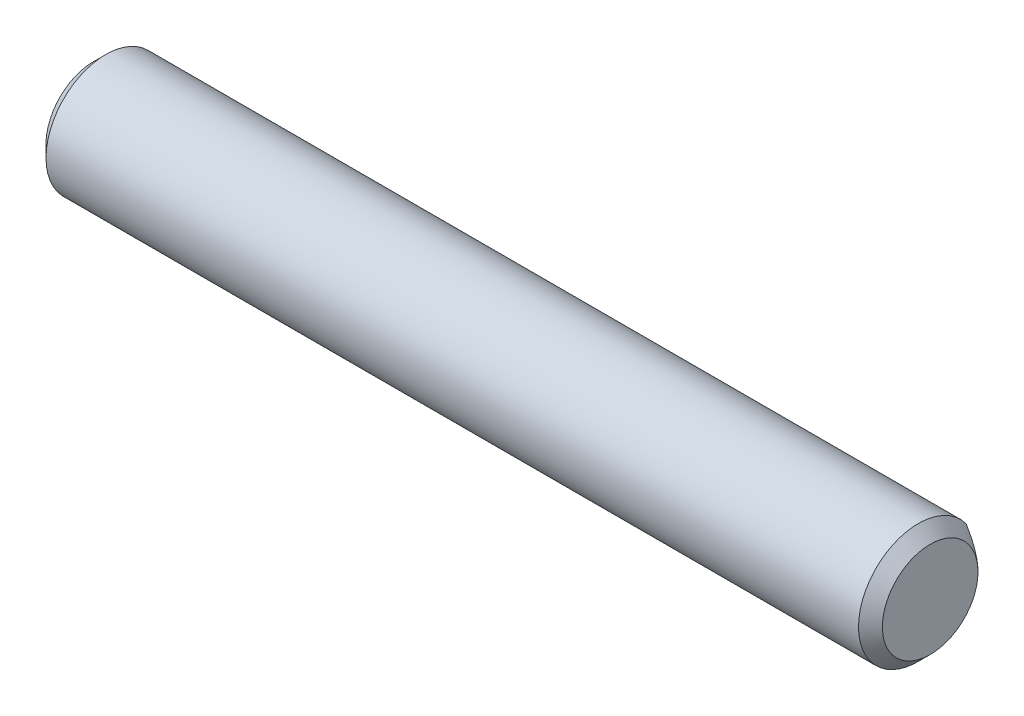
ISO-10303-21;
HEADER;
FILE_DESCRIPTION(('STEP AP214'),'2;1');
FILE_NAME('part.step','',(''),(''),'','','');
FILE_SCHEMA(('AUTOMOTIVE_DESIGN { 1 0 10303 214 1 1 1 1 }'));
ENDSEC;
DATA;
#1=APPLICATION_CONTEXT('core data for automotive mechanical design processes');
#2=APPLICATION_PROTOCOL_DEFINITION('international standard','automotive_design',2000,#1);
#3=PRODUCT_CONTEXT('',#1,'mechanical');
#4=PRODUCT('Part','Part','',(#3));
#5=PRODUCT_RELATED_PRODUCT_CATEGORY('part','',(#4));
#6=PRODUCT_DEFINITION_FORMATION('','',#4);
#7=PRODUCT_DEFINITION_CONTEXT('part definition',#1,'design');
#8=PRODUCT_DEFINITION('design','',#6,#7);
#9=PRODUCT_DEFINITION_SHAPE('','',#8);
#10=(LENGTH_UNIT() NAMED_UNIT(*) SI_UNIT(.MILLI.,.METRE.));
#11=(NAMED_UNIT(*) PLANE_ANGLE_UNIT() SI_UNIT($,.RADIAN.));
#12=(NAMED_UNIT(*) SI_UNIT($,.STERADIAN.) SOLID_ANGLE_UNIT());
#13=UNCERTAINTY_MEASURE_WITH_UNIT(LENGTH_MEASURE(1.E-05),#10,'distance_accuracy_value','');
#14=(GEOMETRIC_REPRESENTATION_CONTEXT(3) GLOBAL_UNCERTAINTY_ASSIGNED_CONTEXT((#13)) GLOBAL_UNIT_ASSIGNED_CONTEXT((#10,
#11,#12)) REPRESENTATION_CONTEXT('',''));
#15=CARTESIAN_POINT('',(0.,0.,0.));
#16=DIRECTION('',(0.,0.,1.));
#17=DIRECTION('',(1.,0.,0.));
#18=AXIS2_PLACEMENT_3D('',#15,#16,#17);
#19=CARTESIAN_POINT('',(0.,0.,-2.5));
#20=DIRECTION('',(1.,0.,0.));
#21=DIRECTION('',(0.,0.,-1.));
#22=AXIS2_PLACEMENT_3D('',#19,#20,#21);
#23=PLANE('',#22);
#24=CARTESIAN_POINT('',(0.,0.,0.));
#25=DIRECTION('',(1.,0.,0.));
#26=DIRECTION('',(0.,0.,-1.));
#27=AXIS2_PLACEMENT_3D('',#24,#25,#26);
#28=CIRCLE('',#27,2.);
#29=CARTESIAN_POINT('',(0.,0.,-2.));
#30=VERTEX_POINT('',#29);
#31=EDGE_CURVE('E128',#30,#30,#28,.T.);
#32=ORIENTED_EDGE('',*,*,#31,.T.);
#33=EDGE_LOOP('',(#32));
#34=FACE_BOUND('',#33,.T.);
#35=ADVANCED_FACE('F42',(#34),#23,.T.);
#36=CARTESIAN_POINT('',(-35.,0.,0.));
#37=DIRECTION('',(-1.,0.,0.));
#38=DIRECTION('',(0.,0.,1.));
#39=AXIS2_PLACEMENT_3D('',#36,#37,#38);
#40=PLANE('',#39);
#41=CARTESIAN_POINT('',(-35.,0.,0.));
#42=DIRECTION('',(-1.,0.,0.));
#43=DIRECTION('',(0.,0.,1.));
#44=AXIS2_PLACEMENT_3D('',#41,#42,#43);
#45=CIRCLE('',#44,2.);
#46=CARTESIAN_POINT('',(-35.,0.,-2.));
#47=VERTEX_POINT('',#46);
#48=EDGE_CURVE('E11',#47,#47,#45,.T.);
#49=ORIENTED_EDGE('',*,*,#48,.T.);
#50=EDGE_LOOP('',(#49));
#51=FACE_BOUND('',#50,.T.);
#52=ADVANCED_FACE('F191',(#51),#40,.T.);
#53=CARTESIAN_POINT('',(0.,0.,0.));
#54=DIRECTION('',(1.,0.,0.));
#55=DIRECTION('',(0.,0.,-1.));
#56=AXIS2_PLACEMENT_3D('',#53,#54,#55);
#57=CYLINDRICAL_SURFACE('',#56,2.5);
#58=DIRECTION('',(1.,0.,0.));
#59=VECTOR('',#58,1.);
#60=CARTESIAN_POINT('',(-8.,-1.49999999999999,-2.));
#61=LINE('',#60,#59);
#62=CARTESIAN_POINT('',(-8.,-1.49999999999999,-2.));
#63=VERTEX_POINT('',#62);
#64=CARTESIAN_POINT('',(-0.499999999999995,-1.49999999999999,-2.));
#65=VERTEX_POINT('',#64);
#66=EDGE_CURVE('E106',#63,#65,#61,.T.);
#67=ORIENTED_EDGE('',*,*,#66,.T.);
#68=CARTESIAN_POINT('',(-0.499999999999995,0.,0.));
#69=DIRECTION('',(1.,0.,0.));
#70=DIRECTION('',(0.,0.,-1.));
#71=AXIS2_PLACEMENT_3D('',#68,#69,#70);
#72=CIRCLE('',#71,2.5);
#73=CARTESIAN_POINT('',(-0.499999999999995,1.49999999999999,-2.));
#74=VERTEX_POINT('',#73);
#75=EDGE_CURVE('E112',#65,#74,#72,.F.);
#76=ORIENTED_EDGE('',*,*,#75,.T.);
#77=DIRECTION('',(1.,0.,0.));
#78=VECTOR('',#77,1.);
#79=CARTESIAN_POINT('',(-8.,1.49999999999999,-2.));
#80=LINE('',#79,#78);
#81=CARTESIAN_POINT('',(-8.,1.49999999999999,-2.));
#82=VERTEX_POINT('',#81);
#83=EDGE_CURVE('E104',#82,#74,#80,.T.);
#84=ORIENTED_EDGE('',*,*,#83,.F.);
#85=CARTESIAN_POINT('',(-8.,0.,0.));
#86=DIRECTION('',(1.,0.,0.));
#87=DIRECTION('',(0.,0.,1.));
#88=AXIS2_PLACEMENT_3D('',#85,#86,#87);
#89=CIRCLE('',#88,2.5);
#90=EDGE_CURVE('E90',#63,#82,#89,.T.);
#91=ORIENTED_EDGE('',*,*,#90,.F.);
#92=EDGE_LOOP('',(#67,#76,#84,#91));
#93=FACE_BOUND('',#92,.T.);
#94=DIRECTION('',(-1.,0.,0.));
#95=VECTOR('',#94,1.);
#96=CARTESIAN_POINT('',(-27.,1.49999999999999,-2.));
#97=LINE('',#96,#95);
#98=CARTESIAN_POINT('',(-27.,1.49999999999999,-2.));
#99=VERTEX_POINT('',#98);
#100=CARTESIAN_POINT('',(-34.5,1.49999999999999,-2.));
#101=VERTEX_POINT('',#100);
#102=EDGE_CURVE('E125',#99,#101,#97,.T.);
#103=ORIENTED_EDGE('',*,*,#102,.T.);
#104=CARTESIAN_POINT('',(-34.5,0.,0.));
#105=DIRECTION('',(-1.,0.,0.));
#106=DIRECTION('',(0.,0.,1.));
#107=AXIS2_PLACEMENT_3D('',#104,#105,#106);
#108=CIRCLE('',#107,2.5);
#109=CARTESIAN_POINT('',(-34.5,-1.49999999999999,-2.));
#110=VERTEX_POINT('',#109);
#111=EDGE_CURVE('E181',#101,#110,#108,.F.);
#112=ORIENTED_EDGE('',*,*,#111,.T.);
#113=DIRECTION('',(-1.,0.,0.));
#114=VECTOR('',#113,1.);
#115=CARTESIAN_POINT('',(-27.,-1.49999999999999,-2.));
#116=LINE('',#115,#114);
#117=CARTESIAN_POINT('',(-27.,-1.49999999999999,-2.));
#118=VERTEX_POINT('',#117);
#119=EDGE_CURVE('E124',#118,#110,#116,.T.);
#120=ORIENTED_EDGE('',*,*,#119,.F.);
#121=CARTESIAN_POINT('',(-27.,0.,0.));
#122=DIRECTION('',(-1.,0.,0.));
#123=DIRECTION('',(0.,0.,1.));
#124=AXIS2_PLACEMENT_3D('',#121,#122,#123);
#125=CIRCLE('',#124,2.5);
#126=EDGE_CURVE('E116',#99,#118,#125,.T.);
#127=ORIENTED_EDGE('',*,*,#126,.F.);
#128=EDGE_LOOP('',(#103,#112,#120,#127));
#129=FACE_BOUND('',#128,.T.);
#130=ADVANCED_FACE('F109',(#93,#129),#57,.T.);
#131=CARTESIAN_POINT('',(-27.,1.49999999999999,-2.));
#132=DIRECTION('',(0.,0.,1.));
#133=DIRECTION('',(1.,0.,0.));
#134=AXIS2_PLACEMENT_3D('',#131,#132,#133);
#135=PLANE('',#134);
#136=ORIENTED_EDGE('',*,*,#119,.T.);
#137=CARTESIAN_POINT('',(-34.5,-1.49999999999999,-2.));
#138=CARTESIAN_POINT('',(-34.5433736980276,-1.42763018659212,-2.));
#139=CARTESIAN_POINT('',(-34.5853687019536,-1.35436226532257,-2.));
#140=CARTESIAN_POINT('',(-34.6656443583189,-1.20549660628808,-2.));
#141=CARTESIAN_POINT('',(-34.7039114197062,-1.12989157710704,-2.));
#142=CARTESIAN_POINT('',(-34.774534191742,-0.978296734874822,-2.));
#143=CARTESIAN_POINT('',(-34.8070165390548,-0.902366736266399,-2.));
#144=CARTESIAN_POINT('',(-34.8658090166989,-0.748220644904065,-2.));
#145=CARTESIAN_POINT('',(-34.8921276624893,-0.670007876047694,-2.));
#146=CARTESIAN_POINT('',(-34.9280861032667,-0.543060600019235,-2.));
#147=CARTESIAN_POINT('',(-34.9401901027996,-0.495021163503635,-2.));
#148=CARTESIAN_POINT('',(-34.9612794306282,-0.398260419217576,-2.));
#149=CARTESIAN_POINT('',(-34.9702651517484,-0.349539198139848,-2.));
#150=CARTESIAN_POINT('',(-34.984927124024,-0.250852177401953,-2.));
#151=CARTESIAN_POINT('',(-34.9905520018212,-0.200878654038625,-2.));
#152=CARTESIAN_POINT('',(-34.9981023484678,-0.100607619276168,-2.));
#153=CARTESIAN_POINT('',(-35.0000243314446,-0.0503098472705237,-2.));
#154=CARTESIAN_POINT('',(-35.,0.,-2.));
#155=B_SPLINE_CURVE_WITH_KNOTS('',3,(#137,#138,#139,#140,#141,#142,#143,#144,#145,#146,#147,
#148,#149,#150,#151,#152,#153,#154),.UNSPECIFIED.,.F.,.F.,(4,2,2,2,2,2,2,2,4),(0.,
0.253195034695596,0.507281075974287,0.754837752612875,1.00205037282501,1.15058504578388,
1.29910100031796,1.44983263801685,1.60070610394699),.UNSPECIFIED.);
#156=EDGE_CURVE('E53',#110,#47,#155,.T.);
#157=ORIENTED_EDGE('',*,*,#156,.T.);
#158=CARTESIAN_POINT('',(-35.,0.,-2.));
#159=CARTESIAN_POINT('',(-35.0000514930088,0.0614966481035614,-2.));
#160=CARTESIAN_POINT('',(-34.997164788165,0.122961796118779,-2.));
#161=CARTESIAN_POINT('',(-34.9859212389057,0.245274670057058,-2.));
#162=CARTESIAN_POINT('',(-34.9775750221521,0.306123362775478,-2.));
#163=CARTESIAN_POINT('',(-34.9559969816614,0.425885509906891,-2.));
#164=CARTESIAN_POINT('',(-34.9428488248966,0.484814317272309,-2.));
#165=CARTESIAN_POINT('',(-34.9122507618696,0.601555526074533,-2.));
#166=CARTESIAN_POINT('',(-34.8947990813251,0.659367456410752,-2.));
#167=CARTESIAN_POINT('',(-34.8525702057821,0.78457626343331,-2.));
#168=CARTESIAN_POINT('',(-34.8270315815753,0.851714510760652,-2.));
#169=CARTESIAN_POINT('',(-34.7717452055525,0.984250024576906,-2.));
#170=CARTESIAN_POINT('',(-34.7419954048129,1.04964642506795,-2.));
#171=CARTESIAN_POINT('',(-34.6784785026746,1.18016546542205,-2.));
#172=CARTESIAN_POINT('',(-34.6446394298057,1.24525271545218,-2.));
#173=CARTESIAN_POINT('',(-34.5742160914667,1.37378197006117,-2.));
#174=CARTESIAN_POINT('',(-34.5376367483736,1.43722666174301,-2.));
#175=CARTESIAN_POINT('',(-34.5,1.49999999999999,-2.));
#176=B_SPLINE_CURVE_WITH_KNOTS('',3,(#158,#159,#160,#161,#162,#163,#164,#165,#166,#167,#168,
#169,#170,#171,#172,#173,#174,#175),.UNSPECIFIED.,.F.,.F.,(4,2,2,2,2,2,2,2,4),(0.,
0.184371949240825,0.368386057907036,0.549336051664292,0.730360773654885,0.945674044871388,
1.16109243790834,1.38109142427277,1.6007042863964),.UNSPECIFIED.);
#177=EDGE_CURVE('E63',#47,#101,#176,.T.);
#178=ORIENTED_EDGE('',*,*,#177,.T.);
#179=ORIENTED_EDGE('',*,*,#102,.F.);
#180=DIRECTION('',(0.,1.,0.));
#181=VECTOR('',#180,1.);
#182=CARTESIAN_POINT('',(-27.,1.49999999999999,-2.));
#183=LINE('',#182,#181);
#184=EDGE_CURVE('E121',#118,#99,#183,.T.);
#185=ORIENTED_EDGE('',*,*,#184,.F.);
#186=EDGE_LOOP('',(#136,#157,#178,#179,#185));
#187=FACE_BOUND('',#186,.T.);
#188=ADVANCED_FACE('F161',(#187),#135,.F.);
#189=CARTESIAN_POINT('',(-27.,0.,0.));
#190=DIRECTION('',(-1.,0.,0.));
#191=DIRECTION('',(0.,0.,1.));
#192=AXIS2_PLACEMENT_3D('',#189,#190,#191);
#193=PLANE('',#192);
#194=ORIENTED_EDGE('',*,*,#126,.T.);
#195=ORIENTED_EDGE('',*,*,#184,.T.);
#196=EDGE_LOOP('',(#194,#195));
#197=FACE_BOUND('',#196,.T.);
#198=ADVANCED_FACE('F157',(#197),#193,.T.);
#199=CARTESIAN_POINT('',(-8.,1.49999999999999,-2.));
#200=DIRECTION('',(0.,0.,1.));
#201=DIRECTION('',(1.,0.,0.));
#202=AXIS2_PLACEMENT_3D('',#199,#200,#201);
#203=PLANE('',#202);
#204=CARTESIAN_POINT('',(-0.499999999999995,1.49999999999999,-2.));
#205=CARTESIAN_POINT('',(-0.456626301972375,1.42763018659212,-2.));
#206=CARTESIAN_POINT('',(-0.414631298046405,1.35436226532257,-2.));
#207=CARTESIAN_POINT('',(-0.334355641681085,1.20549660628808,-2.));
#208=CARTESIAN_POINT('',(-0.29608858029385,1.12989157710704,-2.));
#209=CARTESIAN_POINT('',(-0.225465808258023,0.978296734874816,-2.));
#210=CARTESIAN_POINT('',(-0.192983460945193,0.902366736266392,-2.));
#211=CARTESIAN_POINT('',(-0.134190983301054,0.748220644904057,-2.));
#212=CARTESIAN_POINT('',(-0.107872337510669,0.670007876047687,-2.));
#213=CARTESIAN_POINT('',(-0.0719138967333354,0.543060600019228,-2.));
#214=CARTESIAN_POINT('',(-0.059809897200414,0.495021163503628,-2.));
#215=CARTESIAN_POINT('',(-0.0387205693718198,0.398260419217571,-2.));
#216=CARTESIAN_POINT('',(-0.0297348482516327,0.349539198139844,-2.));
#217=CARTESIAN_POINT('',(-0.0150728759759611,0.25085217740195,-2.));
#218=CARTESIAN_POINT('',(-0.00944799817878033,0.200878654038623,-2.));
#219=CARTESIAN_POINT('',(-0.00189765153224302,0.100607619276167,-2.));
#220=CARTESIAN_POINT('',(2.43314446066038E-05,0.0503098472705232,-2.));
#221=CARTESIAN_POINT('',(0.,0.,-2.));
#222=B_SPLINE_CURVE_WITH_KNOTS('',3,(#204,#205,#206,#207,#208,#209,#210,#211,#212,#213,#214,
#215,#216,#217,#218,#219,#220,#221),.UNSPECIFIED.,.F.,.F.,(4,2,2,2,2,2,2,2,4),(0.,
0.253195034695598,0.507281075974289,0.75483775261288,1.00205037282502,1.15058504578388,
1.29910100031797,1.44983263801685,1.60070610394698),.UNSPECIFIED.);
#223=EDGE_CURVE('E135',#74,#30,#222,.T.);
#224=ORIENTED_EDGE('',*,*,#223,.T.);
#225=CARTESIAN_POINT('',(0.,0.,-2.));
#226=CARTESIAN_POINT('',(5.14930087564156E-05,-0.0614966481035621,-2.));
#227=CARTESIAN_POINT('',(-0.00283521183497991,-0.12296179611878,-2.));
#228=CARTESIAN_POINT('',(-0.0140787610943209,-0.245274670057059,-2.));
#229=CARTESIAN_POINT('',(-0.0224249778479201,-0.306123362775479,-2.));
#230=CARTESIAN_POINT('',(-0.0440030183386294,-0.425885509906893,-2.));
#231=CARTESIAN_POINT('',(-0.0571511751034278,-0.484814317272311,-2.));
#232=CARTESIAN_POINT('',(-0.0877492381304113,-0.601555526074537,-2.));
#233=CARTESIAN_POINT('',(-0.105200918674913,-0.659367456410758,-2.));
#234=CARTESIAN_POINT('',(-0.14742979421792,-0.784576263433316,-2.));
#235=CARTESIAN_POINT('',(-0.172968418424724,-0.851714510760657,-2.));
#236=CARTESIAN_POINT('',(-0.228254794447546,-0.984250024576911,-2.));
#237=CARTESIAN_POINT('',(-0.258004595187102,-1.04964642506795,-2.));
#238=CARTESIAN_POINT('',(-0.321521497325423,-1.18016546542205,-2.));
#239=CARTESIAN_POINT('',(-0.355360570194299,-1.24525271545218,-2.));
#240=CARTESIAN_POINT('',(-0.425783908533259,-1.37378197006117,-2.));
#241=CARTESIAN_POINT('',(-0.462363251626409,-1.43722666174301,-2.));
#242=CARTESIAN_POINT('',(-0.499999999999995,-1.49999999999999,-2.));
#243=B_SPLINE_CURVE_WITH_KNOTS('',3,(#225,#226,#227,#228,#229,#230,#231,#232,#233,#234,#235,
#236,#237,#238,#239,#240,#241,#242),.UNSPECIFIED.,.F.,.F.,(4,2,2,2,2,2,2,2,4),(0.,
0.184371949240825,0.368386057907038,0.549336051664295,0.730360773654891,0.945674044871392,
1.16109243790835,1.38109142427278,1.6007042863964),.UNSPECIFIED.);
#244=EDGE_CURVE('E143',#30,#65,#243,.T.);
#245=ORIENTED_EDGE('',*,*,#244,.T.);
#246=ORIENTED_EDGE('',*,*,#66,.F.);
#247=DIRECTION('',(0.,-1.,0.));
#248=VECTOR('',#247,1.);
#249=CARTESIAN_POINT('',(-8.,1.49999999999999,-2.));
#250=LINE('',#249,#248);
#251=EDGE_CURVE('E93',#82,#63,#250,.T.);
#252=ORIENTED_EDGE('',*,*,#251,.F.);
#253=ORIENTED_EDGE('',*,*,#83,.T.);
#254=EDGE_LOOP('',(#224,#245,#246,#252,#253));
#255=FACE_BOUND('',#254,.T.);
#256=ADVANCED_FACE('F103',(#255),#203,.F.);
#257=CARTESIAN_POINT('',(-8.,0.,0.));
#258=DIRECTION('',(-1.,0.,0.));
#259=DIRECTION('',(0.,0.,1.));
#260=AXIS2_PLACEMENT_3D('',#257,#258,#259);
#261=PLANE('',#260);
#262=ORIENTED_EDGE('',*,*,#90,.T.);
#263=ORIENTED_EDGE('',*,*,#251,.T.);
#264=EDGE_LOOP('',(#262,#263));
#265=FACE_BOUND('',#264,.T.);
#266=ADVANCED_FACE('F92',(#265),#261,.F.);
#267=CARTESIAN_POINT('',(0.,0.,0.));
#268=DIRECTION('',(-1.,0.,0.));
#269=DIRECTION('',(0.,0.,1.));
#270=AXIS2_PLACEMENT_3D('',#267,#268,#269);
#271=CONICAL_SURFACE('',#270,2.,0.78539816339745);
#272=ORIENTED_EDGE('',*,*,#223,.F.);
#273=ORIENTED_EDGE('',*,*,#75,.F.);
#274=ORIENTED_EDGE('',*,*,#244,.F.);
#275=ORIENTED_EDGE('',*,*,#31,.F.);
#276=EDGE_LOOP('',(#272,#273,#274,#275));
#277=FACE_BOUND('',#276,.T.);
#278=ADVANCED_FACE('F150',(#277),#271,.T.);
#279=CARTESIAN_POINT('',(-34.5,0.,0.));
#280=DIRECTION('',(1.,0.,0.));
#281=DIRECTION('',(0.,0.,-1.));
#282=AXIS2_PLACEMENT_3D('',#279,#280,#281);
#283=CONICAL_SURFACE('',#282,2.5,0.785398163397445);
#284=ORIENTED_EDGE('',*,*,#177,.F.);
#285=ORIENTED_EDGE('',*,*,#48,.F.);
#286=ORIENTED_EDGE('',*,*,#156,.F.);
#287=ORIENTED_EDGE('',*,*,#111,.F.);
#288=EDGE_LOOP('',(#284,#285,#286,#287));
#289=FACE_BOUND('',#288,.T.);
#290=ADVANCED_FACE('F45',(#289),#283,.T.);
#291=CLOSED_SHELL('',(#35,#52,#130,#188,#198,#256,#266,#278,#290));
#292=MANIFOLD_SOLID_BREP('B2',#291);
#293=ADVANCED_BREP_SHAPE_REPRESENTATION('',(#18,#292),#14);
#294=SHAPE_DEFINITION_REPRESENTATION(#9,#293);
ENDSEC;
END-ISO-10303-21;
